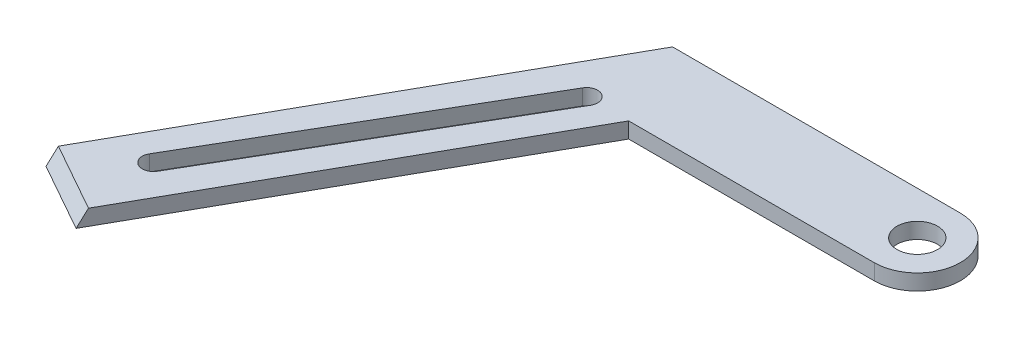
ISO-10303-21;
HEADER;
FILE_DESCRIPTION(('STEP AP214'),'2;1');
FILE_NAME('part.step','',(''),(''),'','','');
FILE_SCHEMA(('AUTOMOTIVE_DESIGN { 1 0 10303 214 1 1 1 1 }'));
ENDSEC;
DATA;
#1=APPLICATION_CONTEXT('core data for automotive mechanical design processes');
#2=APPLICATION_PROTOCOL_DEFINITION('international standard','automotive_design',2000,#1);
#3=PRODUCT_CONTEXT('',#1,'mechanical');
#4=PRODUCT('Part','Part','',(#3));
#5=PRODUCT_RELATED_PRODUCT_CATEGORY('part','',(#4));
#6=PRODUCT_DEFINITION_FORMATION('','',#4);
#7=PRODUCT_DEFINITION_CONTEXT('part definition',#1,'design');
#8=PRODUCT_DEFINITION('design','',#6,#7);
#9=PRODUCT_DEFINITION_SHAPE('','',#8);
#10=(LENGTH_UNIT() NAMED_UNIT(*) SI_UNIT(.MILLI.,.METRE.));
#11=(NAMED_UNIT(*) PLANE_ANGLE_UNIT() SI_UNIT($,.RADIAN.));
#12=(NAMED_UNIT(*) SI_UNIT($,.STERADIAN.) SOLID_ANGLE_UNIT());
#13=UNCERTAINTY_MEASURE_WITH_UNIT(LENGTH_MEASURE(1.E-05),#10,'distance_accuracy_value','');
#14=(GEOMETRIC_REPRESENTATION_CONTEXT(3) GLOBAL_UNCERTAINTY_ASSIGNED_CONTEXT((#13)) GLOBAL_UNIT_ASSIGNED_CONTEXT((#10,
#11,#12)) REPRESENTATION_CONTEXT('',''));
#15=CARTESIAN_POINT('',(0.,0.,0.));
#16=DIRECTION('',(0.,0.,1.));
#17=DIRECTION('',(1.,0.,0.));
#18=AXIS2_PLACEMENT_3D('',#15,#16,#17);
#19=CARTESIAN_POINT('',(0.,3.,0.));
#20=DIRECTION('',(0.,1.,0.));
#21=DIRECTION('',(0.,0.,1.));
#22=AXIS2_PLACEMENT_3D('',#19,#20,#21);
#23=PLANE('',#22);
#24=DIRECTION('',(0.871525584227301,0.,0.490350034197268));
#25=VECTOR('',#24,1.);
#26=CARTESIAN_POINT('',(48.7945945623023,3.,-34.5311659704536));
#27=LINE('',#26,#25);
#28=CARTESIAN_POINT('',(53.1364632221616,3.,-32.0882824976412));
#29=VERTEX_POINT('',#28);
#30=CARTESIAN_POINT('',(66.2251062468484,3.,-24.7241652865082));
#31=VERTEX_POINT('',#30);
#32=EDGE_CURVE('E231',#29,#31,#27,.T.);
#33=ORIENTED_EDGE('',*,*,#32,.T.);
#34=DIRECTION('',(0.490350034197268,0.,-0.871525584227301));
#35=VECTOR('',#34,1.);
#36=CARTESIAN_POINT('',(39.735796373201,3.,22.3567150099555));
#37=LINE('',#36,#35);
#38=CARTESIAN_POINT('',(103.25004788971,3.,-90.5305926259119));
#39=VERTEX_POINT('',#38);
#40=EDGE_CURVE('E161',#31,#39,#37,.T.);
#41=ORIENTED_EDGE('',*,*,#40,.T.);
#42=DIRECTION('',(-1.,0.,0.));
#43=VECTOR('',#42,1.);
#44=CARTESIAN_POINT('',(0.,3.,-90.5305926259119));
#45=LINE('',#44,#43);
#46=CARTESIAN_POINT('',(150.,3.,-90.5305926259119));
#47=VERTEX_POINT('',#46);
#48=EDGE_CURVE('E157',#47,#39,#45,.T.);
#49=ORIENTED_EDGE('',*,*,#48,.F.);
#50=CARTESIAN_POINT('',(150.,3.,-98.7187855009913));
#51=DIRECTION('',(0.,1.,0.));
#52=DIRECTION('',(0.,0.,1.));
#53=AXIS2_PLACEMENT_3D('',#50,#51,#52);
#54=CIRCLE('',#53,8.18819287507942);
#55=CARTESIAN_POINT('',(150.,3.,-106.906978376071));
#56=VERTEX_POINT('',#55);
#57=EDGE_CURVE('E171',#56,#47,#54,.F.);
#58=ORIENTED_EDGE('',*,*,#57,.F.);
#59=DIRECTION('',(1.,0.,0.));
#60=VECTOR('',#59,1.);
#61=CARTESIAN_POINT('',(0.,3.,-106.906978376071));
#62=LINE('',#61,#60);
#63=CARTESIAN_POINT('',(95.2320146856451,3.,-106.906978376071));
#64=VERTEX_POINT('',#63);
#65=EDGE_CURVE('E167',#64,#56,#62,.T.);
#66=ORIENTED_EDGE('',*,*,#65,.F.);
#67=DIRECTION('',(0.490350034197268,0.,-0.871525584227301));
#68=VECTOR('',#67,1.);
#69=CARTESIAN_POINT('',(26.6471533485143,3.,14.9925977988226));
#70=LINE('',#69,#68);
#71=EDGE_CURVE('E164',#29,#64,#70,.T.);
#72=ORIENTED_EDGE('',*,*,#71,.F.);
#73=EDGE_LOOP('',(#33,#41,#49,#58,#66,#72));
#74=FACE_BOUND('',#73,.T.);
#75=CARTESIAN_POINT('',(95.2320146856451,3.,-90.5305926259119));
#76=DIRECTION('',(0.,1.,0.));
#77=DIRECTION('',(0.,0.,1.));
#78=AXIS2_PLACEMENT_3D('',#75,#76,#77);
#79=CIRCLE('',#78,2.1038745155277);
#80=CARTESIAN_POINT('',(97.0499395673079,3.,-89.4716133524044));
#81=VERTEX_POINT('',#80);
#82=CARTESIAN_POINT('',(93.4140898039823,3.,-91.5895718994194));
#83=VERTEX_POINT('',#82);
#84=EDGE_CURVE('E182',#81,#83,#79,.T.);
#85=ORIENTED_EDGE('',*,*,#84,.F.);
#86=DIRECTION('',(0.503347165285589,0.,-0.864084273204276));
#87=VECTOR('',#86,1.);
#88=CARTESIAN_POINT('',(33.5472454460411,3.,19.5419722613244));
#89=LINE('',#88,#87);
#90=CARTESIAN_POINT('',(66.6974701382172,3.,-37.3662409665082));
#91=VERTEX_POINT('',#90);
#92=EDGE_CURVE('E179',#91,#81,#89,.T.);
#93=ORIENTED_EDGE('',*,*,#92,.F.);
#94=CARTESIAN_POINT('',(64.8795452565544,3.,-38.4252202400157));
#95=DIRECTION('',(0.,1.,0.));
#96=DIRECTION('',(0.,0.,1.));
#97=AXIS2_PLACEMENT_3D('',#94,#95,#96);
#98=CIRCLE('',#97,2.1038745155277);
#99=CARTESIAN_POINT('',(63.0616203748916,3.,-39.4841995135232));
#100=VERTEX_POINT('',#99);
#101=EDGE_CURVE('E176',#100,#91,#98,.T.);
#102=ORIENTED_EDGE('',*,*,#101,.F.);
#103=DIRECTION('',(0.503347165285589,0.,-0.864084273204276));
#104=VECTOR('',#103,1.);
#105=CARTESIAN_POINT('',(29.9113956827155,3.,17.4240137143095));
#106=LINE('',#105,#104);
#107=EDGE_CURVE('E128',#100,#83,#106,.T.);
#108=ORIENTED_EDGE('',*,*,#107,.T.);
#109=EDGE_LOOP('',(#85,#93,#102,#108));
#110=FACE_BOUND('',#109,.T.);
#111=CARTESIAN_POINT('',(150.,3.,-98.7187855009913));
#112=DIRECTION('',(0.,1.,0.));
#113=DIRECTION('',(0.,0.,1.));
#114=AXIS2_PLACEMENT_3D('',#111,#112,#113);
#115=CIRCLE('',#114,3.86164973531886);
#116=CARTESIAN_POINT('',(150.,3.,-94.8571357656725));
#117=VERTEX_POINT('',#116);
#118=EDGE_CURVE('E11',#117,#117,#115,.T.);
#119=ORIENTED_EDGE('',*,*,#118,.F.);
#120=EDGE_LOOP('',(#119));
#121=FACE_BOUND('',#120,.T.);
#122=ADVANCED_FACE('F40',(#74,#110,#121),#23,.T.);
#123=CARTESIAN_POINT('',(39.735796373201,3.,22.3567150099555));
#124=DIRECTION('',(-0.871525584227301,0.,-0.490350034197267));
#125=DIRECTION('',(-0.490350034197268,0.,0.871525584227301));
#126=AXIS2_PLACEMENT_3D('',#123,#124,#125);
#127=PLANE('',#126);
#128=ORIENTED_EDGE('',*,*,#40,.F.);
#129=DIRECTION('',(0.245175017098633,0.866025403784441,-0.435762792113647));
#130=VECTOR('',#129,1.);
#131=CARTESIAN_POINT('',(65.3757950741255,0.,-23.2146386945304));
#132=LINE('',#131,#130);
#133=CARTESIAN_POINT('',(65.3757950741255,0.,-23.2146386945304));
#134=VERTEX_POINT('',#133);
#135=EDGE_CURVE('E238',#134,#31,#132,.T.);
#136=ORIENTED_EDGE('',*,*,#135,.F.);
#137=DIRECTION('',(0.490350034197268,0.,-0.871525584227301));
#138=VECTOR('',#137,1.);
#139=CARTESIAN_POINT('',(39.735796373201,0.,22.3567150099555));
#140=LINE('',#139,#138);
#141=CARTESIAN_POINT('',(103.25004788971,0.,-90.5305926259119));
#142=VERTEX_POINT('',#141);
#143=EDGE_CURVE('E187',#134,#142,#140,.T.);
#144=ORIENTED_EDGE('',*,*,#143,.T.);
#145=DIRECTION('',(0.,-1.,0.));
#146=VECTOR('',#145,1.);
#147=CARTESIAN_POINT('',(103.25004788971,3.,-90.5305926259119));
#148=LINE('',#147,#146);
#149=EDGE_CURVE('E209',#39,#142,#148,.T.);
#150=ORIENTED_EDGE('',*,*,#149,.F.);
#151=EDGE_LOOP('',(#128,#136,#144,#150));
#152=FACE_BOUND('',#151,.T.);
#153=ADVANCED_FACE('F250',(#152),#127,.F.);
#154=CARTESIAN_POINT('',(0.,3.,-90.5305926259119));
#155=DIRECTION('',(0.,0.,1.));
#156=DIRECTION('',(1.,0.,0.));
#157=AXIS2_PLACEMENT_3D('',#154,#155,#156);
#158=PLANE('',#157);
#159=DIRECTION('',(-1.,0.,0.));
#160=VECTOR('',#159,1.);
#161=CARTESIAN_POINT('',(0.,0.,-90.5305926259119));
#162=LINE('',#161,#160);
#163=CARTESIAN_POINT('',(150.,0.,-90.5305926259119));
#164=VERTEX_POINT('',#163);
#165=EDGE_CURVE('E184',#164,#142,#162,.T.);
#166=ORIENTED_EDGE('',*,*,#165,.F.);
#167=DIRECTION('',(0.,-1.,0.));
#168=VECTOR('',#167,1.);
#169=CARTESIAN_POINT('',(150.,3.,-90.5305926259119));
#170=LINE('',#169,#168);
#171=EDGE_CURVE('E103',#47,#164,#170,.T.);
#172=ORIENTED_EDGE('',*,*,#171,.F.);
#173=ORIENTED_EDGE('',*,*,#48,.T.);
#174=ORIENTED_EDGE('',*,*,#149,.T.);
#175=EDGE_LOOP('',(#166,#172,#173,#174));
#176=FACE_BOUND('',#175,.T.);
#177=ADVANCED_FACE('F207',(#176),#158,.T.);
#178=CARTESIAN_POINT('',(150.,3.,-98.7187855009913));
#179=DIRECTION('',(0.,-1.,0.));
#180=DIRECTION('',(0.,0.,-1.));
#181=AXIS2_PLACEMENT_3D('',#178,#179,#180);
#182=CYLINDRICAL_SURFACE('',#181,8.18819287507942);
#183=CARTESIAN_POINT('',(150.,0.,-98.7187855009913));
#184=DIRECTION('',(0.,1.,0.));
#185=DIRECTION('',(0.,0.,1.));
#186=AXIS2_PLACEMENT_3D('',#183,#184,#185);
#187=CIRCLE('',#186,8.18819287507942);
#188=CARTESIAN_POINT('',(150.,0.,-106.906978376071));
#189=VERTEX_POINT('',#188);
#190=EDGE_CURVE('E145',#189,#164,#187,.F.);
#191=ORIENTED_EDGE('',*,*,#190,.F.);
#192=DIRECTION('',(0.,-1.,0.));
#193=VECTOR('',#192,1.);
#194=CARTESIAN_POINT('',(150.,3.,-106.906978376071));
#195=LINE('',#194,#193);
#196=EDGE_CURVE('E218',#56,#189,#195,.T.);
#197=ORIENTED_EDGE('',*,*,#196,.F.);
#198=ORIENTED_EDGE('',*,*,#57,.T.);
#199=ORIENTED_EDGE('',*,*,#171,.T.);
#200=EDGE_LOOP('',(#191,#197,#198,#199));
#201=FACE_BOUND('',#200,.T.);
#202=ADVANCED_FACE('F258',(#201),#182,.T.);
#203=CARTESIAN_POINT('',(0.,3.,-106.906978376071));
#204=DIRECTION('',(0.,0.,-1.));
#205=DIRECTION('',(-1.,0.,0.));
#206=AXIS2_PLACEMENT_3D('',#203,#204,#205);
#207=PLANE('',#206);
#208=DIRECTION('',(1.,0.,0.));
#209=VECTOR('',#208,1.);
#210=CARTESIAN_POINT('',(0.,0.,-106.906978376071));
#211=LINE('',#210,#209);
#212=CARTESIAN_POINT('',(95.2320146856451,0.,-106.906978376071));
#213=VERTEX_POINT('',#212);
#214=EDGE_CURVE('E200',#213,#189,#211,.T.);
#215=ORIENTED_EDGE('',*,*,#214,.F.);
#216=DIRECTION('',(0.,-1.,0.));
#217=VECTOR('',#216,1.);
#218=CARTESIAN_POINT('',(95.2320146856451,3.,-106.906978376071));
#219=LINE('',#218,#217);
#220=EDGE_CURVE('E214',#64,#213,#219,.T.);
#221=ORIENTED_EDGE('',*,*,#220,.F.);
#222=ORIENTED_EDGE('',*,*,#65,.T.);
#223=ORIENTED_EDGE('',*,*,#196,.T.);
#224=EDGE_LOOP('',(#215,#221,#222,#223));
#225=FACE_BOUND('',#224,.T.);
#226=ADVANCED_FACE('F286',(#225),#207,.T.);
#227=CARTESIAN_POINT('',(26.6471533485143,3.,14.9925977988226));
#228=DIRECTION('',(-0.871525584227301,0.,-0.490350034197267));
#229=DIRECTION('',(-0.490350034197268,0.,0.871525584227301));
#230=AXIS2_PLACEMENT_3D('',#227,#228,#229);
#231=PLANE('',#230);
#232=DIRECTION('',(-0.245175017098632,-0.866025403784441,0.435762792113648));
#233=VECTOR('',#232,1.);
#234=CARTESIAN_POINT('',(46.5141357537499,-20.3918769036605,-20.3180624235254));
#235=LINE('',#234,#233);
#236=CARTESIAN_POINT('',(52.2871520494388,0.,-30.5787559056634));
#237=VERTEX_POINT('',#236);
#238=EDGE_CURVE('E55',#29,#237,#235,.T.);
#239=ORIENTED_EDGE('',*,*,#238,.F.);
#240=ORIENTED_EDGE('',*,*,#71,.T.);
#241=ORIENTED_EDGE('',*,*,#220,.T.);
#242=DIRECTION('',(0.490350034197268,0.,-0.871525584227301));
#243=VECTOR('',#242,1.);
#244=CARTESIAN_POINT('',(26.6471533485143,0.,14.9925977988226));
#245=LINE('',#244,#243);
#246=EDGE_CURVE('E193',#237,#213,#245,.T.);
#247=ORIENTED_EDGE('',*,*,#246,.F.);
#248=EDGE_LOOP('',(#239,#240,#241,#247));
#249=FACE_BOUND('',#248,.T.);
#250=ADVANCED_FACE('F262',(#249),#231,.T.);
#251=CARTESIAN_POINT('',(33.5472454460411,3.,19.5419722613244));
#252=DIRECTION('',(-0.864084273204276,0.,-0.503347165285589));
#253=DIRECTION('',(-0.503347165285589,0.,0.864084273204276));
#254=AXIS2_PLACEMENT_3D('',#251,#252,#253);
#255=PLANE('',#254);
#256=DIRECTION('',(0.503347165285589,0.,-0.864084273204276));
#257=VECTOR('',#256,1.);
#258=CARTESIAN_POINT('',(33.5472454460411,0.,19.5419722613244));
#259=LINE('',#258,#257);
#260=CARTESIAN_POINT('',(66.6974701382172,0.,-37.3662409665082));
#261=VERTEX_POINT('',#260);
#262=CARTESIAN_POINT('',(97.0499395673079,0.,-89.4716133524044));
#263=VERTEX_POINT('',#262);
#264=EDGE_CURVE('E149',#261,#263,#259,.T.);
#265=ORIENTED_EDGE('',*,*,#264,.F.);
#266=DIRECTION('',(0.,-1.,0.));
#267=VECTOR('',#266,1.);
#268=CARTESIAN_POINT('',(66.6974701382172,3.,-37.3662409665082));
#269=LINE('',#268,#267);
#270=EDGE_CURVE('E135',#91,#261,#269,.T.);
#271=ORIENTED_EDGE('',*,*,#270,.F.);
#272=ORIENTED_EDGE('',*,*,#92,.T.);
#273=DIRECTION('',(0.,-1.,0.));
#274=VECTOR('',#273,1.);
#275=CARTESIAN_POINT('',(97.0499395673079,3.,-89.4716133524044));
#276=LINE('',#275,#274);
#277=EDGE_CURVE('E64',#81,#263,#276,.T.);
#278=ORIENTED_EDGE('',*,*,#277,.T.);
#279=EDGE_LOOP('',(#265,#271,#272,#278));
#280=FACE_BOUND('',#279,.T.);
#281=ADVANCED_FACE('F280',(#280),#255,.T.);
#282=CARTESIAN_POINT('',(64.8795452565544,3.,-38.4252202400157));
#283=DIRECTION('',(0.,-1.,0.));
#284=DIRECTION('',(0.,0.,-1.));
#285=AXIS2_PLACEMENT_3D('',#282,#283,#284);
#286=CYLINDRICAL_SURFACE('',#285,2.1038745155277);
#287=CARTESIAN_POINT('',(64.8795452565544,0.,-38.4252202400157));
#288=DIRECTION('',(0.,1.,0.));
#289=DIRECTION('',(0.,0.,1.));
#290=AXIS2_PLACEMENT_3D('',#287,#288,#289);
#291=CIRCLE('',#290,2.1038745155277);
#292=CARTESIAN_POINT('',(63.0616203748916,0.,-39.4841995135232));
#293=VERTEX_POINT('',#292);
#294=EDGE_CURVE('E142',#293,#261,#291,.T.);
#295=ORIENTED_EDGE('',*,*,#294,.F.);
#296=DIRECTION('',(0.,-1.,0.));
#297=VECTOR('',#296,1.);
#298=CARTESIAN_POINT('',(63.0616203748916,3.,-39.4841995135232));
#299=LINE('',#298,#297);
#300=EDGE_CURVE('E122',#100,#293,#299,.T.);
#301=ORIENTED_EDGE('',*,*,#300,.F.);
#302=ORIENTED_EDGE('',*,*,#101,.T.);
#303=ORIENTED_EDGE('',*,*,#270,.T.);
#304=EDGE_LOOP('',(#295,#301,#302,#303));
#305=FACE_BOUND('',#304,.T.);
#306=ADVANCED_FACE('F147',(#305),#286,.F.);
#307=CARTESIAN_POINT('',(29.9113956827155,3.,17.4240137143095));
#308=DIRECTION('',(-0.864084273204276,0.,-0.503347165285589));
#309=DIRECTION('',(-0.503347165285589,0.,0.864084273204276));
#310=AXIS2_PLACEMENT_3D('',#307,#308,#309);
#311=PLANE('',#310);
#312=DIRECTION('',(0.503347165285589,0.,-0.864084273204276));
#313=VECTOR('',#312,1.);
#314=CARTESIAN_POINT('',(29.9113956827155,0.,17.4240137143095));
#315=LINE('',#314,#313);
#316=CARTESIAN_POINT('',(93.4140898039823,0.,-91.5895718994194));
#317=VERTEX_POINT('',#316);
#318=EDGE_CURVE('E126',#293,#317,#315,.T.);
#319=ORIENTED_EDGE('',*,*,#318,.T.);
#320=DIRECTION('',(0.,-1.,0.));
#321=VECTOR('',#320,1.);
#322=CARTESIAN_POINT('',(93.4140898039823,3.,-91.5895718994194));
#323=LINE('',#322,#321);
#324=EDGE_CURVE('E134',#83,#317,#323,.T.);
#325=ORIENTED_EDGE('',*,*,#324,.F.);
#326=ORIENTED_EDGE('',*,*,#107,.F.);
#327=ORIENTED_EDGE('',*,*,#300,.T.);
#328=EDGE_LOOP('',(#319,#325,#326,#327));
#329=FACE_BOUND('',#328,.T.);
#330=ADVANCED_FACE('F124',(#329),#311,.F.);
#331=CARTESIAN_POINT('',(95.2320146856451,3.,-90.5305926259119));
#332=DIRECTION('',(0.,-1.,0.));
#333=DIRECTION('',(0.,0.,-1.));
#334=AXIS2_PLACEMENT_3D('',#331,#332,#333);
#335=CYLINDRICAL_SURFACE('',#334,2.1038745155277);
#336=CARTESIAN_POINT('',(95.2320146856451,0.,-90.5305926259119));
#337=DIRECTION('',(0.,1.,0.));
#338=DIRECTION('',(0.,0.,1.));
#339=AXIS2_PLACEMENT_3D('',#336,#337,#338);
#340=CIRCLE('',#339,2.1038745155277);
#341=EDGE_CURVE('E143',#263,#317,#340,.T.);
#342=ORIENTED_EDGE('',*,*,#341,.F.);
#343=ORIENTED_EDGE('',*,*,#277,.F.);
#344=ORIENTED_EDGE('',*,*,#84,.T.);
#345=ORIENTED_EDGE('',*,*,#324,.T.);
#346=EDGE_LOOP('',(#342,#343,#344,#345));
#347=FACE_BOUND('',#346,.T.);
#348=ADVANCED_FACE('F268',(#347),#335,.F.);
#349=CARTESIAN_POINT('',(0.,0.,0.));
#350=DIRECTION('',(0.,1.,0.));
#351=DIRECTION('',(0.,0.,1.));
#352=AXIS2_PLACEMENT_3D('',#349,#350,#351);
#353=PLANE('',#352);
#354=ORIENTED_EDGE('',*,*,#341,.T.);
#355=ORIENTED_EDGE('',*,*,#318,.F.);
#356=ORIENTED_EDGE('',*,*,#294,.T.);
#357=ORIENTED_EDGE('',*,*,#264,.T.);
#358=EDGE_LOOP('',(#354,#355,#356,#357));
#359=FACE_BOUND('',#358,.T.);
#360=CARTESIAN_POINT('',(150.,0.,-98.7187855009913));
#361=DIRECTION('',(0.,1.,0.));
#362=DIRECTION('',(0.,0.,1.));
#363=AXIS2_PLACEMENT_3D('',#360,#361,#362);
#364=CIRCLE('',#363,3.86164973531886);
#365=CARTESIAN_POINT('',(150.,0.,-94.8571357656725));
#366=VERTEX_POINT('',#365);
#367=EDGE_CURVE('E43',#366,#366,#364,.T.);
#368=ORIENTED_EDGE('',*,*,#367,.T.);
#369=EDGE_LOOP('',(#368));
#370=FACE_BOUND('',#369,.T.);
#371=ORIENTED_EDGE('',*,*,#143,.F.);
#372=DIRECTION('',(0.871525584227301,0.,0.490350034197268));
#373=VECTOR('',#372,1.);
#374=CARTESIAN_POINT('',(47.9452833895795,0.,-33.0216393784758));
#375=LINE('',#374,#373);
#376=EDGE_CURVE('E235',#237,#134,#375,.T.);
#377=ORIENTED_EDGE('',*,*,#376,.F.);
#378=ORIENTED_EDGE('',*,*,#246,.T.);
#379=ORIENTED_EDGE('',*,*,#214,.T.);
#380=ORIENTED_EDGE('',*,*,#190,.T.);
#381=ORIENTED_EDGE('',*,*,#165,.T.);
#382=EDGE_LOOP('',(#371,#377,#378,#379,#380,#381));
#383=FACE_BOUND('',#382,.T.);
#384=ADVANCED_FACE('F139',(#359,#370,#383),#353,.F.);
#385=CARTESIAN_POINT('',(150.,0.,-98.7187855009913));
#386=DIRECTION('',(0.,1.,0.));
#387=DIRECTION('',(0.,0.,1.));
#388=AXIS2_PLACEMENT_3D('',#385,#386,#387);
#389=CYLINDRICAL_SURFACE('',#388,3.86164973531886);
#390=ORIENTED_EDGE('',*,*,#367,.F.);
#391=EDGE_LOOP('',(#390));
#392=FACE_BOUND('',#391,.T.);
#393=ORIENTED_EDGE('',*,*,#118,.T.);
#394=EDGE_LOOP('',(#393));
#395=FACE_BOUND('',#394,.T.);
#396=ADVANCED_FACE('F260',(#392,#395),#389,.F.);
#397=CARTESIAN_POINT('',(47.9452833895795,0.,-33.0216393784758));
#398=DIRECTION('',(0.424655586361403,-0.499999999999996,-0.754763295988919));
#399=DIRECTION('',(0.,0.833665596159347,-0.552269566226748));
#400=AXIS2_PLACEMENT_3D('',#397,#398,#399);
#401=PLANE('',#400);
#402=ORIENTED_EDGE('',*,*,#238,.T.);
#403=ORIENTED_EDGE('',*,*,#376,.T.);
#404=ORIENTED_EDGE('',*,*,#135,.T.);
#405=ORIENTED_EDGE('',*,*,#32,.F.);
#406=EDGE_LOOP('',(#402,#403,#404,#405));
#407=FACE_BOUND('',#406,.T.);
#408=ADVANCED_FACE('F243',(#407),#401,.F.);
#409=CLOSED_SHELL('',(#122,#153,#177,#202,#226,#250,#281,#306,#330,#348,#384,#396,#408));
#410=MANIFOLD_SOLID_BREP('B2',#409);
#411=ADVANCED_BREP_SHAPE_REPRESENTATION('',(#18,#410),#14);
#412=SHAPE_DEFINITION_REPRESENTATION(#9,#411);
ENDSEC;
END-ISO-10303-21;
